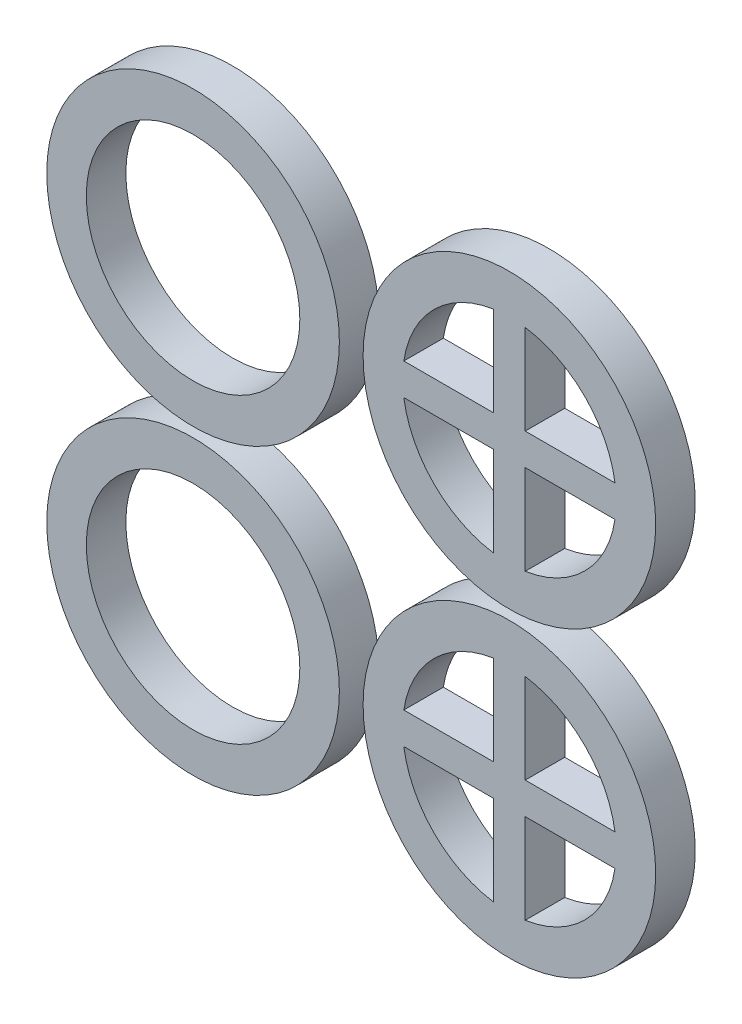
ISO-10303-21;
HEADER;
FILE_DESCRIPTION(('STEP AP214'),'2;1');
FILE_NAME('part.step','',(''),(''),'','','');
FILE_SCHEMA(('AUTOMOTIVE_DESIGN { 1 0 10303 214 1 1 1 1 }'));
ENDSEC;
DATA;
#1=APPLICATION_CONTEXT('core data for automotive mechanical design processes');
#2=APPLICATION_PROTOCOL_DEFINITION('international standard','automotive_design',2000,#1);
#3=PRODUCT_CONTEXT('',#1,'mechanical');
#4=PRODUCT('Part','Part','',(#3));
#5=PRODUCT_RELATED_PRODUCT_CATEGORY('part','',(#4));
#6=PRODUCT_DEFINITION_FORMATION('','',#4);
#7=PRODUCT_DEFINITION_CONTEXT('part definition',#1,'design');
#8=PRODUCT_DEFINITION('design','',#6,#7);
#9=PRODUCT_DEFINITION_SHAPE('','',#8);
#10=(LENGTH_UNIT() NAMED_UNIT(*) SI_UNIT(.MILLI.,.METRE.));
#11=(NAMED_UNIT(*) PLANE_ANGLE_UNIT() SI_UNIT($,.RADIAN.));
#12=(NAMED_UNIT(*) SI_UNIT($,.STERADIAN.) SOLID_ANGLE_UNIT());
#13=UNCERTAINTY_MEASURE_WITH_UNIT(LENGTH_MEASURE(1.E-05),#10,'distance_accuracy_value','');
#14=(GEOMETRIC_REPRESENTATION_CONTEXT(3) GLOBAL_UNCERTAINTY_ASSIGNED_CONTEXT((#13)) GLOBAL_UNIT_ASSIGNED_CONTEXT((#10,
#11,#12)) REPRESENTATION_CONTEXT('',''));
#15=CARTESIAN_POINT('',(0.,0.,0.));
#16=DIRECTION('',(0.,0.,1.));
#17=DIRECTION('',(1.,0.,0.));
#18=AXIS2_PLACEMENT_3D('',#15,#16,#17);
#19=CARTESIAN_POINT('',(40.,-38.2182769009653,5.));
#20=DIRECTION('',(0.,0.,1.));
#21=DIRECTION('',(1.,0.,0.));
#22=AXIS2_PLACEMENT_3D('',#19,#20,#21);
#23=PLANE('',#22);
#24=CARTESIAN_POINT('',(40.,-38.2182769009653,5.));
#25=DIRECTION('',(0.,0.,1.));
#26=DIRECTION('',(1.,0.,0.));
#27=AXIS2_PLACEMENT_3D('',#24,#25,#26);
#28=CIRCLE('',#27,18.5);
#29=CARTESIAN_POINT('',(58.5,-38.2182769009653,5.));
#30=VERTEX_POINT('',#29);
#31=EDGE_CURVE('E12',#30,#30,#28,.T.);
#32=ORIENTED_EDGE('',*,*,#31,.T.);
#33=EDGE_LOOP('',(#32));
#34=FACE_BOUND('',#33,.T.);
#35=DIRECTION('',(1.,0.,0.));
#36=VECTOR('',#35,1.);
#37=CARTESIAN_POINT('',(26.6489700771813,-36.2182769009653,5.));
#38=LINE('',#37,#36);
#39=CARTESIAN_POINT('',(26.6489700771813,-36.2182769009653,5.));
#40=VERTEX_POINT('',#39);
#41=CARTESIAN_POINT('',(38.,-36.2182769009653,5.));
#42=VERTEX_POINT('',#41);
#43=EDGE_CURVE('E208',#40,#42,#38,.T.);
#44=ORIENTED_EDGE('',*,*,#43,.F.);
#45=CARTESIAN_POINT('',(40.,-38.2182769009653,5.));
#46=DIRECTION('',(0.,0.,1.));
#47=DIRECTION('',(1.,0.,0.));
#48=AXIS2_PLACEMENT_3D('',#45,#46,#47);
#49=CIRCLE('',#48,13.5);
#50=CARTESIAN_POINT('',(38.,-24.8672469781466,5.));
#51=VERTEX_POINT('',#50);
#52=EDGE_CURVE('E206',#51,#40,#49,.T.);
#53=ORIENTED_EDGE('',*,*,#52,.F.);
#54=DIRECTION('',(0.,1.,0.));
#55=VECTOR('',#54,1.);
#56=CARTESIAN_POINT('',(38.,-24.8672469781466,5.));
#57=LINE('',#56,#55);
#58=EDGE_CURVE('E212',#42,#51,#57,.T.);
#59=ORIENTED_EDGE('',*,*,#58,.F.);
#60=EDGE_LOOP('',(#44,#53,#59));
#61=FACE_BOUND('',#60,.T.);
#62=DIRECTION('',(0.,1.,0.));
#63=VECTOR('',#62,1.);
#64=CARTESIAN_POINT('',(38.,-40.2182769009653,5.));
#65=LINE('',#64,#63);
#66=CARTESIAN_POINT('',(38.,-51.569306823784,5.));
#67=VERTEX_POINT('',#66);
#68=CARTESIAN_POINT('',(38.,-40.2182769009653,5.));
#69=VERTEX_POINT('',#68);
#70=EDGE_CURVE('E184',#67,#69,#65,.T.);
#71=ORIENTED_EDGE('',*,*,#70,.F.);
#72=CARTESIAN_POINT('',(40.,-38.2182769009653,5.));
#73=DIRECTION('',(0.,0.,1.));
#74=DIRECTION('',(1.,0.,0.));
#75=AXIS2_PLACEMENT_3D('',#72,#73,#74);
#76=CIRCLE('',#75,13.5);
#77=CARTESIAN_POINT('',(26.6489700771813,-40.2182769009653,5.));
#78=VERTEX_POINT('',#77);
#79=EDGE_CURVE('E182',#78,#67,#76,.T.);
#80=ORIENTED_EDGE('',*,*,#79,.F.);
#81=DIRECTION('',(-1.,0.,0.));
#82=VECTOR('',#81,1.);
#83=CARTESIAN_POINT('',(26.6489700771813,-40.2182769009653,5.));
#84=LINE('',#83,#82);
#85=EDGE_CURVE('E188',#69,#78,#84,.T.);
#86=ORIENTED_EDGE('',*,*,#85,.F.);
#87=EDGE_LOOP('',(#71,#80,#86));
#88=FACE_BOUND('',#87,.T.);
#89=DIRECTION('',(-1.,0.,0.));
#90=VECTOR('',#89,1.);
#91=CARTESIAN_POINT('',(42.,-40.2182769009653,5.));
#92=LINE('',#91,#90);
#93=CARTESIAN_POINT('',(53.3510299228187,-40.2182769009653,5.));
#94=VERTEX_POINT('',#93);
#95=CARTESIAN_POINT('',(42.,-40.2182769009653,5.));
#96=VERTEX_POINT('',#95);
#97=EDGE_CURVE('E160',#94,#96,#92,.T.);
#98=ORIENTED_EDGE('',*,*,#97,.F.);
#99=CARTESIAN_POINT('',(40.,-38.2182769009653,5.));
#100=DIRECTION('',(0.,0.,1.));
#101=DIRECTION('',(1.,0.,0.));
#102=AXIS2_PLACEMENT_3D('',#99,#100,#101);
#103=CIRCLE('',#102,13.5);
#104=CARTESIAN_POINT('',(42.,-51.569306823784,5.));
#105=VERTEX_POINT('',#104);
#106=EDGE_CURVE('E158',#105,#94,#103,.T.);
#107=ORIENTED_EDGE('',*,*,#106,.F.);
#108=DIRECTION('',(0.,-1.,0.));
#109=VECTOR('',#108,1.);
#110=CARTESIAN_POINT('',(42.,-40.2182769009653,5.));
#111=LINE('',#110,#109);
#112=EDGE_CURVE('E164',#96,#105,#111,.T.);
#113=ORIENTED_EDGE('',*,*,#112,.F.);
#114=EDGE_LOOP('',(#98,#107,#113));
#115=FACE_BOUND('',#114,.T.);
#116=DIRECTION('',(0.,-1.,0.));
#117=VECTOR('',#116,1.);
#118=CARTESIAN_POINT('',(42.,-24.8672469781466,5.));
#119=LINE('',#118,#117);
#120=CARTESIAN_POINT('',(42.,-24.8672469781466,5.));
#121=VERTEX_POINT('',#120);
#122=CARTESIAN_POINT('',(42.,-36.2182769009653,5.));
#123=VERTEX_POINT('',#122);
#124=EDGE_CURVE('E139',#121,#123,#119,.T.);
#125=ORIENTED_EDGE('',*,*,#124,.F.);
#126=CARTESIAN_POINT('',(40.,-38.2182769009653,5.));
#127=DIRECTION('',(0.,0.,1.));
#128=DIRECTION('',(1.,0.,0.));
#129=AXIS2_PLACEMENT_3D('',#126,#127,#128);
#130=CIRCLE('',#129,13.5);
#131=CARTESIAN_POINT('',(53.3510299228187,-36.2182769009653,5.));
#132=VERTEX_POINT('',#131);
#133=EDGE_CURVE('E131',#132,#121,#130,.T.);
#134=ORIENTED_EDGE('',*,*,#133,.F.);
#135=DIRECTION('',(1.,0.,0.));
#136=VECTOR('',#135,1.);
#137=CARTESIAN_POINT('',(42.,-36.2182769009653,5.));
#138=LINE('',#137,#136);
#139=EDGE_CURVE('E148',#123,#132,#138,.T.);
#140=ORIENTED_EDGE('',*,*,#139,.F.);
#141=EDGE_LOOP('',(#125,#134,#140));
#142=FACE_BOUND('',#141,.T.);
#143=ADVANCED_FACE('F42',(#34,#61,#88,#115,#142),#23,.T.);
#144=CARTESIAN_POINT('',(40.,-38.2182769009653,0.));
#145=DIRECTION('',(0.,0.,1.));
#146=DIRECTION('',(1.,0.,0.));
#147=AXIS2_PLACEMENT_3D('',#144,#145,#146);
#148=PLANE('',#147);
#149=CARTESIAN_POINT('',(40.,-38.2182769009653,0.));
#150=DIRECTION('',(0.,0.,1.));
#151=DIRECTION('',(1.,0.,0.));
#152=AXIS2_PLACEMENT_3D('',#149,#150,#151);
#153=CIRCLE('',#152,13.5);
#154=CARTESIAN_POINT('',(42.,-51.569306823784,0.));
#155=VERTEX_POINT('',#154);
#156=CARTESIAN_POINT('',(53.3510299228187,-40.2182769009653,0.));
#157=VERTEX_POINT('',#156);
#158=EDGE_CURVE('E146',#155,#157,#153,.T.);
#159=ORIENTED_EDGE('',*,*,#158,.T.);
#160=DIRECTION('',(-1.,0.,0.));
#161=VECTOR('',#160,1.);
#162=CARTESIAN_POINT('',(42.,-40.2182769009653,0.));
#163=LINE('',#162,#161);
#164=CARTESIAN_POINT('',(42.,-40.2182769009653,0.));
#165=VERTEX_POINT('',#164);
#166=EDGE_CURVE('E169',#157,#165,#163,.T.);
#167=ORIENTED_EDGE('',*,*,#166,.T.);
#168=DIRECTION('',(0.,-1.,0.));
#169=VECTOR('',#168,1.);
#170=CARTESIAN_POINT('',(42.,-40.2182769009653,0.));
#171=LINE('',#170,#169);
#172=EDGE_CURVE('E161',#165,#155,#171,.T.);
#173=ORIENTED_EDGE('',*,*,#172,.T.);
#174=EDGE_LOOP('',(#159,#167,#173));
#175=FACE_BOUND('',#174,.T.);
#176=CARTESIAN_POINT('',(40.,-38.2182769009653,0.));
#177=DIRECTION('',(0.,0.,1.));
#178=DIRECTION('',(1.,0.,0.));
#179=AXIS2_PLACEMENT_3D('',#176,#177,#178);
#180=CIRCLE('',#179,13.5);
#181=CARTESIAN_POINT('',(38.,-24.8672469781466,0.));
#182=VERTEX_POINT('',#181);
#183=CARTESIAN_POINT('',(26.6489700771813,-36.2182769009653,0.));
#184=VERTEX_POINT('',#183);
#185=EDGE_CURVE('E205',#182,#184,#180,.T.);
#186=ORIENTED_EDGE('',*,*,#185,.T.);
#187=DIRECTION('',(1.,0.,0.));
#188=VECTOR('',#187,1.);
#189=CARTESIAN_POINT('',(26.6489700771813,-36.2182769009653,0.));
#190=LINE('',#189,#188);
#191=CARTESIAN_POINT('',(38.,-36.2182769009653,0.));
#192=VERTEX_POINT('',#191);
#193=EDGE_CURVE('E217',#184,#192,#190,.T.);
#194=ORIENTED_EDGE('',*,*,#193,.T.);
#195=DIRECTION('',(0.,1.,0.));
#196=VECTOR('',#195,1.);
#197=CARTESIAN_POINT('',(38.,-24.8672469781466,0.));
#198=LINE('',#197,#196);
#199=EDGE_CURVE('E209',#192,#182,#198,.T.);
#200=ORIENTED_EDGE('',*,*,#199,.T.);
#201=EDGE_LOOP('',(#186,#194,#200));
#202=FACE_BOUND('',#201,.T.);
#203=CARTESIAN_POINT('',(40.,-38.2182769009653,0.));
#204=DIRECTION('',(0.,0.,1.));
#205=DIRECTION('',(1.,0.,0.));
#206=AXIS2_PLACEMENT_3D('',#203,#204,#205);
#207=CIRCLE('',#206,18.5);
#208=CARTESIAN_POINT('',(58.5,-38.2182769009653,0.));
#209=VERTEX_POINT('',#208);
#210=EDGE_CURVE('E46',#209,#209,#207,.T.);
#211=ORIENTED_EDGE('',*,*,#210,.F.);
#212=EDGE_LOOP('',(#211));
#213=FACE_BOUND('',#212,.T.);
#214=CARTESIAN_POINT('',(40.,-38.2182769009653,0.));
#215=DIRECTION('',(0.,0.,1.));
#216=DIRECTION('',(1.,0.,0.));
#217=AXIS2_PLACEMENT_3D('',#214,#215,#216);
#218=CIRCLE('',#217,13.5);
#219=CARTESIAN_POINT('',(26.6489700771813,-40.2182769009653,0.));
#220=VERTEX_POINT('',#219);
#221=CARTESIAN_POINT('',(38.,-51.569306823784,0.));
#222=VERTEX_POINT('',#221);
#223=EDGE_CURVE('E181',#220,#222,#218,.T.);
#224=ORIENTED_EDGE('',*,*,#223,.T.);
#225=DIRECTION('',(0.,1.,0.));
#226=VECTOR('',#225,1.);
#227=CARTESIAN_POINT('',(38.,-40.2182769009653,0.));
#228=LINE('',#227,#226);
#229=CARTESIAN_POINT('',(38.,-40.2182769009653,0.));
#230=VERTEX_POINT('',#229);
#231=EDGE_CURVE('E193',#222,#230,#228,.T.);
#232=ORIENTED_EDGE('',*,*,#231,.T.);
#233=DIRECTION('',(-1.,0.,0.));
#234=VECTOR('',#233,1.);
#235=CARTESIAN_POINT('',(26.6489700771813,-40.2182769009653,0.));
#236=LINE('',#235,#234);
#237=EDGE_CURVE('E185',#230,#220,#236,.T.);
#238=ORIENTED_EDGE('',*,*,#237,.T.);
#239=EDGE_LOOP('',(#224,#232,#238));
#240=FACE_BOUND('',#239,.T.);
#241=CARTESIAN_POINT('',(40.,-38.2182769009653,0.));
#242=DIRECTION('',(0.,0.,1.));
#243=DIRECTION('',(1.,0.,0.));
#244=AXIS2_PLACEMENT_3D('',#241,#242,#243);
#245=CIRCLE('',#244,13.5);
#246=CARTESIAN_POINT('',(53.3510299228187,-36.2182769009653,0.));
#247=VERTEX_POINT('',#246);
#248=CARTESIAN_POINT('',(42.,-24.8672469781466,0.));
#249=VERTEX_POINT('',#248);
#250=EDGE_CURVE('E65',#247,#249,#245,.T.);
#251=ORIENTED_EDGE('',*,*,#250,.T.);
#252=DIRECTION('',(0.,-1.,0.));
#253=VECTOR('',#252,1.);
#254=CARTESIAN_POINT('',(42.,-24.8672469781466,0.));
#255=LINE('',#254,#253);
#256=CARTESIAN_POINT('',(42.,-36.2182769009653,0.));
#257=VERTEX_POINT('',#256);
#258=EDGE_CURVE('E145',#249,#257,#255,.T.);
#259=ORIENTED_EDGE('',*,*,#258,.T.);
#260=DIRECTION('',(1.,0.,0.));
#261=VECTOR('',#260,1.);
#262=CARTESIAN_POINT('',(42.,-36.2182769009653,0.));
#263=LINE('',#262,#261);
#264=EDGE_CURVE('E140',#257,#247,#263,.T.);
#265=ORIENTED_EDGE('',*,*,#264,.T.);
#266=EDGE_LOOP('',(#251,#259,#265));
#267=FACE_BOUND('',#266,.T.);
#268=ADVANCED_FACE('F234',(#175,#202,#213,#240,#267),#148,.F.);
#269=CARTESIAN_POINT('',(40.,-38.2182769009653,5.));
#270=DIRECTION('',(0.,0.,-1.));
#271=DIRECTION('',(-1.,0.,0.));
#272=AXIS2_PLACEMENT_3D('',#269,#270,#271);
#273=CYLINDRICAL_SURFACE('',#272,18.5);
#274=ORIENTED_EDGE('',*,*,#31,.F.);
#275=EDGE_LOOP('',(#274));
#276=FACE_BOUND('',#275,.T.);
#277=ORIENTED_EDGE('',*,*,#210,.T.);
#278=EDGE_LOOP('',(#277));
#279=FACE_BOUND('',#278,.T.);
#280=ADVANCED_FACE('F44',(#276,#279),#273,.T.);
#281=CARTESIAN_POINT('',(40.,-38.2182769009653,5.));
#282=DIRECTION('',(0.,0.,-1.));
#283=DIRECTION('',(-1.,0.,0.));
#284=AXIS2_PLACEMENT_3D('',#281,#282,#283);
#285=CYLINDRICAL_SURFACE('',#284,13.5);
#286=ORIENTED_EDGE('',*,*,#185,.F.);
#287=DIRECTION('',(0.,0.,-1.));
#288=VECTOR('',#287,1.);
#289=CARTESIAN_POINT('',(38.,-24.8672469781466,5.));
#290=LINE('',#289,#288);
#291=EDGE_CURVE('E214',#51,#182,#290,.T.);
#292=ORIENTED_EDGE('',*,*,#291,.F.);
#293=ORIENTED_EDGE('',*,*,#52,.T.);
#294=DIRECTION('',(0.,0.,-1.));
#295=VECTOR('',#294,1.);
#296=CARTESIAN_POINT('',(26.6489700771813,-36.2182769009653,5.));
#297=LINE('',#296,#295);
#298=EDGE_CURVE('E226',#40,#184,#297,.T.);
#299=ORIENTED_EDGE('',*,*,#298,.T.);
#300=EDGE_LOOP('',(#286,#292,#293,#299));
#301=FACE_BOUND('',#300,.T.);
#302=ADVANCED_FACE('F253',(#301),#285,.F.);
#303=CARTESIAN_POINT('',(26.6489700771813,-36.2182769009653,5.));
#304=DIRECTION('',(0.,1.,0.));
#305=DIRECTION('',(0.,0.,1.));
#306=AXIS2_PLACEMENT_3D('',#303,#304,#305);
#307=PLANE('',#306);
#308=ORIENTED_EDGE('',*,*,#193,.F.);
#309=ORIENTED_EDGE('',*,*,#298,.F.);
#310=ORIENTED_EDGE('',*,*,#43,.T.);
#311=DIRECTION('',(0.,0.,-1.));
#312=VECTOR('',#311,1.);
#313=CARTESIAN_POINT('',(38.,-36.2182769009653,5.));
#314=LINE('',#313,#312);
#315=EDGE_CURVE('E224',#42,#192,#314,.T.);
#316=ORIENTED_EDGE('',*,*,#315,.T.);
#317=EDGE_LOOP('',(#308,#309,#310,#316));
#318=FACE_BOUND('',#317,.T.);
#319=ADVANCED_FACE('F256',(#318),#307,.T.);
#320=CARTESIAN_POINT('',(38.,-24.8672469781466,5.));
#321=DIRECTION('',(-1.,0.,0.));
#322=DIRECTION('',(0.,0.,1.));
#323=AXIS2_PLACEMENT_3D('',#320,#321,#322);
#324=PLANE('',#323);
#325=ORIENTED_EDGE('',*,*,#199,.F.);
#326=ORIENTED_EDGE('',*,*,#315,.F.);
#327=ORIENTED_EDGE('',*,*,#58,.T.);
#328=ORIENTED_EDGE('',*,*,#291,.T.);
#329=EDGE_LOOP('',(#325,#326,#327,#328));
#330=FACE_BOUND('',#329,.T.);
#331=ADVANCED_FACE('F259',(#330),#324,.T.);
#332=CARTESIAN_POINT('',(40.,-38.2182769009653,5.));
#333=DIRECTION('',(0.,0.,-1.));
#334=DIRECTION('',(-1.,0.,0.));
#335=AXIS2_PLACEMENT_3D('',#332,#333,#334);
#336=CYLINDRICAL_SURFACE('',#335,13.5);
#337=ORIENTED_EDGE('',*,*,#223,.F.);
#338=DIRECTION('',(0.,0.,-1.));
#339=VECTOR('',#338,1.);
#340=CARTESIAN_POINT('',(26.6489700771813,-40.2182769009653,5.));
#341=LINE('',#340,#339);
#342=EDGE_CURVE('E190',#78,#220,#341,.T.);
#343=ORIENTED_EDGE('',*,*,#342,.F.);
#344=ORIENTED_EDGE('',*,*,#79,.T.);
#345=DIRECTION('',(0.,0.,-1.));
#346=VECTOR('',#345,1.);
#347=CARTESIAN_POINT('',(38.,-51.569306823784,5.));
#348=LINE('',#347,#346);
#349=EDGE_CURVE('E202',#67,#222,#348,.T.);
#350=ORIENTED_EDGE('',*,*,#349,.T.);
#351=EDGE_LOOP('',(#337,#343,#344,#350));
#352=FACE_BOUND('',#351,.T.);
#353=ADVANCED_FACE('F263',(#352),#336,.F.);
#354=CARTESIAN_POINT('',(38.,-40.2182769009653,5.));
#355=DIRECTION('',(-1.,0.,0.));
#356=DIRECTION('',(0.,0.,1.));
#357=AXIS2_PLACEMENT_3D('',#354,#355,#356);
#358=PLANE('',#357);
#359=ORIENTED_EDGE('',*,*,#231,.F.);
#360=ORIENTED_EDGE('',*,*,#349,.F.);
#361=ORIENTED_EDGE('',*,*,#70,.T.);
#362=DIRECTION('',(0.,0.,-1.));
#363=VECTOR('',#362,1.);
#364=CARTESIAN_POINT('',(38.,-40.2182769009653,5.));
#365=LINE('',#364,#363);
#366=EDGE_CURVE('E200',#69,#230,#365,.T.);
#367=ORIENTED_EDGE('',*,*,#366,.T.);
#368=EDGE_LOOP('',(#359,#360,#361,#367));
#369=FACE_BOUND('',#368,.T.);
#370=ADVANCED_FACE('F267',(#369),#358,.T.);
#371=CARTESIAN_POINT('',(26.6489700771813,-40.2182769009653,5.));
#372=DIRECTION('',(0.,-1.,0.));
#373=DIRECTION('',(0.,0.,-1.));
#374=AXIS2_PLACEMENT_3D('',#371,#372,#373);
#375=PLANE('',#374);
#376=ORIENTED_EDGE('',*,*,#237,.F.);
#377=ORIENTED_EDGE('',*,*,#366,.F.);
#378=ORIENTED_EDGE('',*,*,#85,.T.);
#379=ORIENTED_EDGE('',*,*,#342,.T.);
#380=EDGE_LOOP('',(#376,#377,#378,#379));
#381=FACE_BOUND('',#380,.T.);
#382=ADVANCED_FACE('F271',(#381),#375,.T.);
#383=CARTESIAN_POINT('',(40.,-38.2182769009653,5.));
#384=DIRECTION('',(0.,0.,-1.));
#385=DIRECTION('',(-1.,0.,0.));
#386=AXIS2_PLACEMENT_3D('',#383,#384,#385);
#387=CYLINDRICAL_SURFACE('',#386,13.5);
#388=ORIENTED_EDGE('',*,*,#158,.F.);
#389=DIRECTION('',(0.,0.,-1.));
#390=VECTOR('',#389,1.);
#391=CARTESIAN_POINT('',(42.,-51.569306823784,5.));
#392=LINE('',#391,#390);
#393=EDGE_CURVE('E166',#105,#155,#392,.T.);
#394=ORIENTED_EDGE('',*,*,#393,.F.);
#395=ORIENTED_EDGE('',*,*,#106,.T.);
#396=DIRECTION('',(0.,0.,-1.));
#397=VECTOR('',#396,1.);
#398=CARTESIAN_POINT('',(53.3510299228187,-40.2182769009653,5.));
#399=LINE('',#398,#397);
#400=EDGE_CURVE('E178',#94,#157,#399,.T.);
#401=ORIENTED_EDGE('',*,*,#400,.T.);
#402=EDGE_LOOP('',(#388,#394,#395,#401));
#403=FACE_BOUND('',#402,.T.);
#404=ADVANCED_FACE('F275',(#403),#387,.F.);
#405=CARTESIAN_POINT('',(42.,-40.2182769009653,5.));
#406=DIRECTION('',(0.,-1.,0.));
#407=DIRECTION('',(0.,0.,-1.));
#408=AXIS2_PLACEMENT_3D('',#405,#406,#407);
#409=PLANE('',#408);
#410=ORIENTED_EDGE('',*,*,#166,.F.);
#411=ORIENTED_EDGE('',*,*,#400,.F.);
#412=ORIENTED_EDGE('',*,*,#97,.T.);
#413=DIRECTION('',(0.,0.,-1.));
#414=VECTOR('',#413,1.);
#415=CARTESIAN_POINT('',(42.,-40.2182769009653,5.));
#416=LINE('',#415,#414);
#417=EDGE_CURVE('E176',#96,#165,#416,.T.);
#418=ORIENTED_EDGE('',*,*,#417,.T.);
#419=EDGE_LOOP('',(#410,#411,#412,#418));
#420=FACE_BOUND('',#419,.T.);
#421=ADVANCED_FACE('F279',(#420),#409,.T.);
#422=CARTESIAN_POINT('',(42.,-40.2182769009653,5.));
#423=DIRECTION('',(1.,0.,0.));
#424=DIRECTION('',(0.,0.,-1.));
#425=AXIS2_PLACEMENT_3D('',#422,#423,#424);
#426=PLANE('',#425);
#427=ORIENTED_EDGE('',*,*,#172,.F.);
#428=ORIENTED_EDGE('',*,*,#417,.F.);
#429=ORIENTED_EDGE('',*,*,#112,.T.);
#430=ORIENTED_EDGE('',*,*,#393,.T.);
#431=EDGE_LOOP('',(#427,#428,#429,#430));
#432=FACE_BOUND('',#431,.T.);
#433=ADVANCED_FACE('F283',(#432),#426,.T.);
#434=CARTESIAN_POINT('',(40.,-38.2182769009653,5.));
#435=DIRECTION('',(0.,0.,-1.));
#436=DIRECTION('',(-1.,0.,0.));
#437=AXIS2_PLACEMENT_3D('',#434,#435,#436);
#438=CYLINDRICAL_SURFACE('',#437,13.5);
#439=ORIENTED_EDGE('',*,*,#250,.F.);
#440=DIRECTION('',(0.,0.,-1.));
#441=VECTOR('',#440,1.);
#442=CARTESIAN_POINT('',(53.3510299228187,-36.2182769009653,5.));
#443=LINE('',#442,#441);
#444=EDGE_CURVE('E135',#132,#247,#443,.T.);
#445=ORIENTED_EDGE('',*,*,#444,.F.);
#446=ORIENTED_EDGE('',*,*,#133,.T.);
#447=DIRECTION('',(0.,0.,-1.));
#448=VECTOR('',#447,1.);
#449=CARTESIAN_POINT('',(42.,-24.8672469781466,5.));
#450=LINE('',#449,#448);
#451=EDGE_CURVE('E134',#121,#249,#450,.T.);
#452=ORIENTED_EDGE('',*,*,#451,.T.);
#453=EDGE_LOOP('',(#439,#445,#446,#452));
#454=FACE_BOUND('',#453,.T.);
#455=ADVANCED_FACE('F133',(#454),#438,.F.);
#456=CARTESIAN_POINT('',(42.,-24.8672469781466,5.));
#457=DIRECTION('',(1.,0.,0.));
#458=DIRECTION('',(0.,0.,-1.));
#459=AXIS2_PLACEMENT_3D('',#456,#457,#458);
#460=PLANE('',#459);
#461=ORIENTED_EDGE('',*,*,#258,.F.);
#462=ORIENTED_EDGE('',*,*,#451,.F.);
#463=ORIENTED_EDGE('',*,*,#124,.T.);
#464=DIRECTION('',(0.,0.,-1.));
#465=VECTOR('',#464,1.);
#466=CARTESIAN_POINT('',(42.,-36.2182769009653,5.));
#467=LINE('',#466,#465);
#468=EDGE_CURVE('E57',#123,#257,#467,.T.);
#469=ORIENTED_EDGE('',*,*,#468,.T.);
#470=EDGE_LOOP('',(#461,#462,#463,#469));
#471=FACE_BOUND('',#470,.T.);
#472=ADVANCED_FACE('F143',(#471),#460,.T.);
#473=CARTESIAN_POINT('',(42.,-36.2182769009653,5.));
#474=DIRECTION('',(0.,1.,0.));
#475=DIRECTION('',(0.,0.,1.));
#476=AXIS2_PLACEMENT_3D('',#473,#474,#475);
#477=PLANE('',#476);
#478=ORIENTED_EDGE('',*,*,#264,.F.);
#479=ORIENTED_EDGE('',*,*,#468,.F.);
#480=ORIENTED_EDGE('',*,*,#139,.T.);
#481=ORIENTED_EDGE('',*,*,#444,.T.);
#482=EDGE_LOOP('',(#478,#479,#480,#481));
#483=FACE_BOUND('',#482,.T.);
#484=ADVANCED_FACE('F239',(#483),#477,.T.);
#485=CLOSED_SHELL('',(#143,#268,#280,#302,#319,#331,#353,#370,#382,#404,#421,#433,#455,#472,#484));
#486=MANIFOLD_SOLID_BREP('B2',#485);
#487=CARTESIAN_POINT('',(0.,-38.2182769009653,5.));
#488=DIRECTION('',(0.,0.,1.));
#489=DIRECTION('',(1.,0.,0.));
#490=AXIS2_PLACEMENT_3D('',#487,#488,#489);
#491=PLANE('',#490);
#492=CARTESIAN_POINT('',(0.,-38.2182769009653,5.));
#493=DIRECTION('',(0.,0.,1.));
#494=DIRECTION('',(1.,0.,0.));
#495=AXIS2_PLACEMENT_3D('',#492,#493,#494);
#496=CIRCLE('',#495,18.5);
#497=CARTESIAN_POINT('',(18.5,-38.2182769009653,5.));
#498=VERTEX_POINT('',#497);
#499=EDGE_CURVE('E41',#498,#498,#496,.T.);
#500=ORIENTED_EDGE('',*,*,#499,.T.);
#501=EDGE_LOOP('',(#500));
#502=FACE_BOUND('',#501,.T.);
#503=CARTESIAN_POINT('',(0.,-38.2182769009653,5.));
#504=DIRECTION('',(0.,0.,1.));
#505=DIRECTION('',(1.,0.,0.));
#506=AXIS2_PLACEMENT_3D('',#503,#504,#505);
#507=CIRCLE('',#506,13.5);
#508=CARTESIAN_POINT('',(13.5,-38.2182769009653,5.));
#509=VERTEX_POINT('',#508);
#510=EDGE_CURVE('E422',#509,#509,#507,.T.);
#511=ORIENTED_EDGE('',*,*,#510,.F.);
#512=EDGE_LOOP('',(#511));
#513=FACE_BOUND('',#512,.T.);
#514=ADVANCED_FACE('F411',(#502,#513),#491,.T.);
#515=CARTESIAN_POINT('',(0.,-38.2182769009653,0.));
#516=DIRECTION('',(0.,0.,1.));
#517=DIRECTION('',(1.,0.,0.));
#518=AXIS2_PLACEMENT_3D('',#515,#516,#517);
#519=PLANE('',#518);
#520=CARTESIAN_POINT('',(0.,-38.2182769009653,0.));
#521=DIRECTION('',(0.,0.,1.));
#522=DIRECTION('',(1.,0.,0.));
#523=AXIS2_PLACEMENT_3D('',#520,#521,#522);
#524=CIRCLE('',#523,18.5);
#525=CARTESIAN_POINT('',(18.5,-38.2182769009653,0.));
#526=VERTEX_POINT('',#525);
#527=EDGE_CURVE('E415',#526,#526,#524,.T.);
#528=ORIENTED_EDGE('',*,*,#527,.F.);
#529=EDGE_LOOP('',(#528));
#530=FACE_BOUND('',#529,.T.);
#531=CARTESIAN_POINT('',(0.,-38.2182769009653,0.));
#532=DIRECTION('',(0.,0.,1.));
#533=DIRECTION('',(1.,0.,0.));
#534=AXIS2_PLACEMENT_3D('',#531,#532,#533);
#535=CIRCLE('',#534,13.5);
#536=CARTESIAN_POINT('',(13.5,-38.2182769009653,0.));
#537=VERTEX_POINT('',#536);
#538=EDGE_CURVE('E424',#537,#537,#535,.T.);
#539=ORIENTED_EDGE('',*,*,#538,.T.);
#540=EDGE_LOOP('',(#539));
#541=FACE_BOUND('',#540,.T.);
#542=ADVANCED_FACE('F434',(#530,#541),#519,.F.);
#543=CARTESIAN_POINT('',(0.,-38.2182769009653,5.));
#544=DIRECTION('',(0.,0.,-1.));
#545=DIRECTION('',(-1.,0.,0.));
#546=AXIS2_PLACEMENT_3D('',#543,#544,#545);
#547=CYLINDRICAL_SURFACE('',#546,18.5);
#548=ORIENTED_EDGE('',*,*,#499,.F.);
#549=EDGE_LOOP('',(#548));
#550=FACE_BOUND('',#549,.T.);
#551=ORIENTED_EDGE('',*,*,#527,.T.);
#552=EDGE_LOOP('',(#551));
#553=FACE_BOUND('',#552,.T.);
#554=ADVANCED_FACE('F413',(#550,#553),#547,.T.);
#555=CARTESIAN_POINT('',(0.,-38.2182769009653,5.));
#556=DIRECTION('',(0.,0.,-1.));
#557=DIRECTION('',(-1.,0.,0.));
#558=AXIS2_PLACEMENT_3D('',#555,#556,#557);
#559=CYLINDRICAL_SURFACE('',#558,13.5);
#560=ORIENTED_EDGE('',*,*,#510,.T.);
#561=EDGE_LOOP('',(#560));
#562=FACE_BOUND('',#561,.T.);
#563=ORIENTED_EDGE('',*,*,#538,.F.);
#564=EDGE_LOOP('',(#563));
#565=FACE_BOUND('',#564,.T.);
#566=ADVANCED_FACE('F430',(#562,#565),#559,.F.);
#567=CLOSED_SHELL('',(#514,#542,#554,#566));
#568=MANIFOLD_SOLID_BREP('B6',#567);
#569=CARTESIAN_POINT('',(40.,0.,5.));
#570=DIRECTION('',(0.,0.,1.));
#571=DIRECTION('',(1.,0.,0.));
#572=AXIS2_PLACEMENT_3D('',#569,#570,#571);
#573=PLANE('',#572);
#574=CARTESIAN_POINT('',(40.,0.,5.));
#575=DIRECTION('',(0.,0.,1.));
#576=DIRECTION('',(1.,0.,0.));
#577=AXIS2_PLACEMENT_3D('',#574,#575,#576);
#578=CIRCLE('',#577,18.5);
#579=CARTESIAN_POINT('',(58.5,0.,5.));
#580=VERTEX_POINT('',#579);
#581=EDGE_CURVE('E409',#580,#580,#578,.T.);
#582=ORIENTED_EDGE('',*,*,#581,.T.);
#583=EDGE_LOOP('',(#582));
#584=FACE_BOUND('',#583,.T.);
#585=DIRECTION('',(1.,0.,0.));
#586=VECTOR('',#585,1.);
#587=CARTESIAN_POINT('',(26.6489700771813,2.,5.));
#588=LINE('',#587,#586);
#589=CARTESIAN_POINT('',(26.6489700771813,2.,5.));
#590=VERTEX_POINT('',#589);
#591=CARTESIAN_POINT('',(38.,2.,5.));
#592=VERTEX_POINT('',#591);
#593=EDGE_CURVE('E646',#590,#592,#588,.T.);
#594=ORIENTED_EDGE('',*,*,#593,.F.);
#595=CARTESIAN_POINT('',(40.,0.,5.));
#596=DIRECTION('',(0.,0.,1.));
#597=DIRECTION('',(1.,0.,0.));
#598=AXIS2_PLACEMENT_3D('',#595,#596,#597);
#599=CIRCLE('',#598,13.5);
#600=CARTESIAN_POINT('',(38.,13.3510299228187,5.));
#601=VERTEX_POINT('',#600);
#602=EDGE_CURVE('E644',#601,#590,#599,.T.);
#603=ORIENTED_EDGE('',*,*,#602,.F.);
#604=DIRECTION('',(0.,1.,0.));
#605=VECTOR('',#604,1.);
#606=CARTESIAN_POINT('',(38.,13.3510299228187,5.));
#607=LINE('',#606,#605);
#608=EDGE_CURVE('E650',#592,#601,#607,.T.);
#609=ORIENTED_EDGE('',*,*,#608,.F.);
#610=EDGE_LOOP('',(#594,#603,#609));
#611=FACE_BOUND('',#610,.T.);
#612=DIRECTION('',(0.,1.,0.));
#613=VECTOR('',#612,1.);
#614=CARTESIAN_POINT('',(38.,-2.,5.));
#615=LINE('',#614,#613);
#616=CARTESIAN_POINT('',(38.,-13.3510299228187,5.));
#617=VERTEX_POINT('',#616);
#618=CARTESIAN_POINT('',(38.,-2.,5.));
#619=VERTEX_POINT('',#618);
#620=EDGE_CURVE('E622',#617,#619,#615,.T.);
#621=ORIENTED_EDGE('',*,*,#620,.F.);
#622=CARTESIAN_POINT('',(40.,0.,5.));
#623=DIRECTION('',(0.,0.,1.));
#624=DIRECTION('',(1.,0.,0.));
#625=AXIS2_PLACEMENT_3D('',#622,#623,#624);
#626=CIRCLE('',#625,13.5);
#627=CARTESIAN_POINT('',(26.6489700771813,-2.,5.));
#628=VERTEX_POINT('',#627);
#629=EDGE_CURVE('E620',#628,#617,#626,.T.);
#630=ORIENTED_EDGE('',*,*,#629,.F.);
#631=DIRECTION('',(-1.,0.,0.));
#632=VECTOR('',#631,1.);
#633=CARTESIAN_POINT('',(26.6489700771813,-2.,5.));
#634=LINE('',#633,#632);
#635=EDGE_CURVE('E626',#619,#628,#634,.T.);
#636=ORIENTED_EDGE('',*,*,#635,.F.);
#637=EDGE_LOOP('',(#621,#630,#636));
#638=FACE_BOUND('',#637,.T.);
#639=DIRECTION('',(-1.,0.,0.));
#640=VECTOR('',#639,1.);
#641=CARTESIAN_POINT('',(42.,-2.,5.));
#642=LINE('',#641,#640);
#643=CARTESIAN_POINT('',(53.3510299228187,-2.,5.));
#644=VERTEX_POINT('',#643);
#645=CARTESIAN_POINT('',(42.,-2.,5.));
#646=VERTEX_POINT('',#645);
#647=EDGE_CURVE('E598',#644,#646,#642,.T.);
#648=ORIENTED_EDGE('',*,*,#647,.F.);
#649=CARTESIAN_POINT('',(40.,0.,5.));
#650=DIRECTION('',(0.,0.,1.));
#651=DIRECTION('',(1.,0.,0.));
#652=AXIS2_PLACEMENT_3D('',#649,#650,#651);
#653=CIRCLE('',#652,13.5);
#654=CARTESIAN_POINT('',(42.,-13.3510299228187,5.));
#655=VERTEX_POINT('',#654);
#656=EDGE_CURVE('E596',#655,#644,#653,.T.);
#657=ORIENTED_EDGE('',*,*,#656,.F.);
#658=DIRECTION('',(0.,-1.,0.));
#659=VECTOR('',#658,1.);
#660=CARTESIAN_POINT('',(42.,-2.,5.));
#661=LINE('',#660,#659);
#662=EDGE_CURVE('E602',#646,#655,#661,.T.);
#663=ORIENTED_EDGE('',*,*,#662,.F.);
#664=EDGE_LOOP('',(#648,#657,#663));
#665=FACE_BOUND('',#664,.T.);
#666=DIRECTION('',(0.,-1.,0.));
#667=VECTOR('',#666,1.);
#668=CARTESIAN_POINT('',(42.,13.3510299228187,5.));
#669=LINE('',#668,#667);
#670=CARTESIAN_POINT('',(42.,13.3510299228187,5.));
#671=VERTEX_POINT('',#670);
#672=CARTESIAN_POINT('',(42.,2.,5.));
#673=VERTEX_POINT('',#672);
#674=EDGE_CURVE('E577',#671,#673,#669,.T.);
#675=ORIENTED_EDGE('',*,*,#674,.F.);
#676=CARTESIAN_POINT('',(40.,0.,5.));
#677=DIRECTION('',(0.,0.,1.));
#678=DIRECTION('',(1.,0.,0.));
#679=AXIS2_PLACEMENT_3D('',#676,#677,#678);
#680=CIRCLE('',#679,13.5);
#681=CARTESIAN_POINT('',(53.3510299228187,2.,5.));
#682=VERTEX_POINT('',#681);
#683=EDGE_CURVE('E569',#682,#671,#680,.T.);
#684=ORIENTED_EDGE('',*,*,#683,.F.);
#685=DIRECTION('',(1.,0.,0.));
#686=VECTOR('',#685,1.);
#687=CARTESIAN_POINT('',(42.,2.,5.));
#688=LINE('',#687,#686);
#689=EDGE_CURVE('E586',#673,#682,#688,.T.);
#690=ORIENTED_EDGE('',*,*,#689,.F.);
#691=EDGE_LOOP('',(#675,#684,#690));
#692=FACE_BOUND('',#691,.T.);
#693=ADVANCED_FACE('F480',(#584,#611,#638,#665,#692),#573,.T.);
#694=CARTESIAN_POINT('',(40.,0.,0.));
#695=DIRECTION('',(0.,0.,1.));
#696=DIRECTION('',(1.,0.,0.));
#697=AXIS2_PLACEMENT_3D('',#694,#695,#696);
#698=PLANE('',#697);
#699=CARTESIAN_POINT('',(40.,0.,0.));
#700=DIRECTION('',(0.,0.,1.));
#701=DIRECTION('',(1.,0.,0.));
#702=AXIS2_PLACEMENT_3D('',#699,#700,#701);
#703=CIRCLE('',#702,13.5);
#704=CARTESIAN_POINT('',(42.,-13.3510299228187,0.));
#705=VERTEX_POINT('',#704);
#706=CARTESIAN_POINT('',(53.3510299228187,-2.,0.));
#707=VERTEX_POINT('',#706);
#708=EDGE_CURVE('E584',#705,#707,#703,.T.);
#709=ORIENTED_EDGE('',*,*,#708,.T.);
#710=DIRECTION('',(-1.,0.,0.));
#711=VECTOR('',#710,1.);
#712=CARTESIAN_POINT('',(42.,-2.,0.));
#713=LINE('',#712,#711);
#714=CARTESIAN_POINT('',(42.,-2.,0.));
#715=VERTEX_POINT('',#714);
#716=EDGE_CURVE('E607',#707,#715,#713,.T.);
#717=ORIENTED_EDGE('',*,*,#716,.T.);
#718=DIRECTION('',(0.,-1.,0.));
#719=VECTOR('',#718,1.);
#720=CARTESIAN_POINT('',(42.,-2.,0.));
#721=LINE('',#720,#719);
#722=EDGE_CURVE('E599',#715,#705,#721,.T.);
#723=ORIENTED_EDGE('',*,*,#722,.T.);
#724=EDGE_LOOP('',(#709,#717,#723));
#725=FACE_BOUND('',#724,.T.);
#726=CARTESIAN_POINT('',(40.,0.,0.));
#727=DIRECTION('',(0.,0.,1.));
#728=DIRECTION('',(1.,0.,0.));
#729=AXIS2_PLACEMENT_3D('',#726,#727,#728);
#730=CIRCLE('',#729,13.5);
#731=CARTESIAN_POINT('',(38.,13.3510299228187,0.));
#732=VERTEX_POINT('',#731);
#733=CARTESIAN_POINT('',(26.6489700771813,2.,0.));
#734=VERTEX_POINT('',#733);
#735=EDGE_CURVE('E643',#732,#734,#730,.T.);
#736=ORIENTED_EDGE('',*,*,#735,.T.);
#737=DIRECTION('',(1.,0.,0.));
#738=VECTOR('',#737,1.);
#739=CARTESIAN_POINT('',(26.6489700771813,2.,0.));
#740=LINE('',#739,#738);
#741=CARTESIAN_POINT('',(38.,2.,0.));
#742=VERTEX_POINT('',#741);
#743=EDGE_CURVE('E655',#734,#742,#740,.T.);
#744=ORIENTED_EDGE('',*,*,#743,.T.);
#745=DIRECTION('',(0.,1.,0.));
#746=VECTOR('',#745,1.);
#747=CARTESIAN_POINT('',(38.,13.3510299228187,0.));
#748=LINE('',#747,#746);
#749=EDGE_CURVE('E647',#742,#732,#748,.T.);
#750=ORIENTED_EDGE('',*,*,#749,.T.);
#751=EDGE_LOOP('',(#736,#744,#750));
#752=FACE_BOUND('',#751,.T.);
#753=CARTESIAN_POINT('',(40.,0.,0.));
#754=DIRECTION('',(0.,0.,1.));
#755=DIRECTION('',(1.,0.,0.));
#756=AXIS2_PLACEMENT_3D('',#753,#754,#755);
#757=CIRCLE('',#756,18.5);
#758=CARTESIAN_POINT('',(58.5,0.,0.));
#759=VERTEX_POINT('',#758);
#760=EDGE_CURVE('E484',#759,#759,#757,.T.);
#761=ORIENTED_EDGE('',*,*,#760,.F.);
#762=EDGE_LOOP('',(#761));
#763=FACE_BOUND('',#762,.T.);
#764=CARTESIAN_POINT('',(40.,0.,0.));
#765=DIRECTION('',(0.,0.,1.));
#766=DIRECTION('',(1.,0.,0.));
#767=AXIS2_PLACEMENT_3D('',#764,#765,#766);
#768=CIRCLE('',#767,13.5);
#769=CARTESIAN_POINT('',(26.6489700771813,-2.,0.));
#770=VERTEX_POINT('',#769);
#771=CARTESIAN_POINT('',(38.,-13.3510299228187,0.));
#772=VERTEX_POINT('',#771);
#773=EDGE_CURVE('E619',#770,#772,#768,.T.);
#774=ORIENTED_EDGE('',*,*,#773,.T.);
#775=DIRECTION('',(0.,1.,0.));
#776=VECTOR('',#775,1.);
#777=CARTESIAN_POINT('',(38.,-2.,0.));
#778=LINE('',#777,#776);
#779=CARTESIAN_POINT('',(38.,-2.,0.));
#780=VERTEX_POINT('',#779);
#781=EDGE_CURVE('E631',#772,#780,#778,.T.);
#782=ORIENTED_EDGE('',*,*,#781,.T.);
#783=DIRECTION('',(-1.,0.,0.));
#784=VECTOR('',#783,1.);
#785=CARTESIAN_POINT('',(26.6489700771813,-2.,0.));
#786=LINE('',#785,#784);
#787=EDGE_CURVE('E623',#780,#770,#786,.T.);
#788=ORIENTED_EDGE('',*,*,#787,.T.);
#789=EDGE_LOOP('',(#774,#782,#788));
#790=FACE_BOUND('',#789,.T.);
#791=CARTESIAN_POINT('',(40.,0.,0.));
#792=DIRECTION('',(0.,0.,1.));
#793=DIRECTION('',(1.,0.,0.));
#794=AXIS2_PLACEMENT_3D('',#791,#792,#793);
#795=CIRCLE('',#794,13.5);
#796=CARTESIAN_POINT('',(53.3510299228187,2.,0.));
#797=VERTEX_POINT('',#796);
#798=CARTESIAN_POINT('',(42.,13.3510299228187,0.));
#799=VERTEX_POINT('',#798);
#800=EDGE_CURVE('E503',#797,#799,#795,.T.);
#801=ORIENTED_EDGE('',*,*,#800,.T.);
#802=DIRECTION('',(0.,-1.,0.));
#803=VECTOR('',#802,1.);
#804=CARTESIAN_POINT('',(42.,13.3510299228187,0.));
#805=LINE('',#804,#803);
#806=CARTESIAN_POINT('',(42.,2.,0.));
#807=VERTEX_POINT('',#806);
#808=EDGE_CURVE('E583',#799,#807,#805,.T.);
#809=ORIENTED_EDGE('',*,*,#808,.T.);
#810=DIRECTION('',(1.,0.,0.));
#811=VECTOR('',#810,1.);
#812=CARTESIAN_POINT('',(42.,2.,0.));
#813=LINE('',#812,#811);
#814=EDGE_CURVE('E578',#807,#797,#813,.T.);
#815=ORIENTED_EDGE('',*,*,#814,.T.);
#816=EDGE_LOOP('',(#801,#809,#815));
#817=FACE_BOUND('',#816,.T.);
#818=ADVANCED_FACE('F672',(#725,#752,#763,#790,#817),#698,.F.);
#819=CARTESIAN_POINT('',(40.,0.,5.));
#820=DIRECTION('',(0.,0.,-1.));
#821=DIRECTION('',(-1.,0.,0.));
#822=AXIS2_PLACEMENT_3D('',#819,#820,#821);
#823=CYLINDRICAL_SURFACE('',#822,18.5);
#824=ORIENTED_EDGE('',*,*,#581,.F.);
#825=EDGE_LOOP('',(#824));
#826=FACE_BOUND('',#825,.T.);
#827=ORIENTED_EDGE('',*,*,#760,.T.);
#828=EDGE_LOOP('',(#827));
#829=FACE_BOUND('',#828,.T.);
#830=ADVANCED_FACE('F482',(#826,#829),#823,.T.);
#831=CARTESIAN_POINT('',(40.,0.,5.));
#832=DIRECTION('',(0.,0.,-1.));
#833=DIRECTION('',(-1.,0.,0.));
#834=AXIS2_PLACEMENT_3D('',#831,#832,#833);
#835=CYLINDRICAL_SURFACE('',#834,13.5);
#836=ORIENTED_EDGE('',*,*,#735,.F.);
#837=DIRECTION('',(0.,0.,-1.));
#838=VECTOR('',#837,1.);
#839=CARTESIAN_POINT('',(38.,13.3510299228187,5.));
#840=LINE('',#839,#838);
#841=EDGE_CURVE('E652',#601,#732,#840,.T.);
#842=ORIENTED_EDGE('',*,*,#841,.F.);
#843=ORIENTED_EDGE('',*,*,#602,.T.);
#844=DIRECTION('',(0.,0.,-1.));
#845=VECTOR('',#844,1.);
#846=CARTESIAN_POINT('',(26.6489700771813,2.,5.));
#847=LINE('',#846,#845);
#848=EDGE_CURVE('E664',#590,#734,#847,.T.);
#849=ORIENTED_EDGE('',*,*,#848,.T.);
#850=EDGE_LOOP('',(#836,#842,#843,#849));
#851=FACE_BOUND('',#850,.T.);
#852=ADVANCED_FACE('F691',(#851),#835,.F.);
#853=CARTESIAN_POINT('',(26.6489700771813,2.,5.));
#854=DIRECTION('',(0.,1.,0.));
#855=DIRECTION('',(0.,0.,1.));
#856=AXIS2_PLACEMENT_3D('',#853,#854,#855);
#857=PLANE('',#856);
#858=ORIENTED_EDGE('',*,*,#743,.F.);
#859=ORIENTED_EDGE('',*,*,#848,.F.);
#860=ORIENTED_EDGE('',*,*,#593,.T.);
#861=DIRECTION('',(0.,0.,-1.));
#862=VECTOR('',#861,1.);
#863=CARTESIAN_POINT('',(38.,2.,5.));
#864=LINE('',#863,#862);
#865=EDGE_CURVE('E662',#592,#742,#864,.T.);
#866=ORIENTED_EDGE('',*,*,#865,.T.);
#867=EDGE_LOOP('',(#858,#859,#860,#866));
#868=FACE_BOUND('',#867,.T.);
#869=ADVANCED_FACE('F694',(#868),#857,.T.);
#870=CARTESIAN_POINT('',(38.,13.3510299228187,5.));
#871=DIRECTION('',(-1.,0.,0.));
#872=DIRECTION('',(0.,0.,1.));
#873=AXIS2_PLACEMENT_3D('',#870,#871,#872);
#874=PLANE('',#873);
#875=ORIENTED_EDGE('',*,*,#749,.F.);
#876=ORIENTED_EDGE('',*,*,#865,.F.);
#877=ORIENTED_EDGE('',*,*,#608,.T.);
#878=ORIENTED_EDGE('',*,*,#841,.T.);
#879=EDGE_LOOP('',(#875,#876,#877,#878));
#880=FACE_BOUND('',#879,.T.);
#881=ADVANCED_FACE('F697',(#880),#874,.T.);
#882=CARTESIAN_POINT('',(40.,0.,5.));
#883=DIRECTION('',(0.,0.,-1.));
#884=DIRECTION('',(-1.,0.,0.));
#885=AXIS2_PLACEMENT_3D('',#882,#883,#884);
#886=CYLINDRICAL_SURFACE('',#885,13.5);
#887=ORIENTED_EDGE('',*,*,#773,.F.);
#888=DIRECTION('',(0.,0.,-1.));
#889=VECTOR('',#888,1.);
#890=CARTESIAN_POINT('',(26.6489700771813,-2.,5.));
#891=LINE('',#890,#889);
#892=EDGE_CURVE('E628',#628,#770,#891,.T.);
#893=ORIENTED_EDGE('',*,*,#892,.F.);
#894=ORIENTED_EDGE('',*,*,#629,.T.);
#895=DIRECTION('',(0.,0.,-1.));
#896=VECTOR('',#895,1.);
#897=CARTESIAN_POINT('',(38.,-13.3510299228187,5.));
#898=LINE('',#897,#896);
#899=EDGE_CURVE('E640',#617,#772,#898,.T.);
#900=ORIENTED_EDGE('',*,*,#899,.T.);
#901=EDGE_LOOP('',(#887,#893,#894,#900));
#902=FACE_BOUND('',#901,.T.);
#903=ADVANCED_FACE('F701',(#902),#886,.F.);
#904=CARTESIAN_POINT('',(38.,-2.,5.));
#905=DIRECTION('',(-1.,0.,0.));
#906=DIRECTION('',(0.,0.,1.));
#907=AXIS2_PLACEMENT_3D('',#904,#905,#906);
#908=PLANE('',#907);
#909=ORIENTED_EDGE('',*,*,#781,.F.);
#910=ORIENTED_EDGE('',*,*,#899,.F.);
#911=ORIENTED_EDGE('',*,*,#620,.T.);
#912=DIRECTION('',(0.,0.,-1.));
#913=VECTOR('',#912,1.);
#914=CARTESIAN_POINT('',(38.,-2.,5.));
#915=LINE('',#914,#913);
#916=EDGE_CURVE('E638',#619,#780,#915,.T.);
#917=ORIENTED_EDGE('',*,*,#916,.T.);
#918=EDGE_LOOP('',(#909,#910,#911,#917));
#919=FACE_BOUND('',#918,.T.);
#920=ADVANCED_FACE('F705',(#919),#908,.T.);
#921=CARTESIAN_POINT('',(26.6489700771813,-2.,5.));
#922=DIRECTION('',(0.,-1.,0.));
#923=DIRECTION('',(0.,0.,-1.));
#924=AXIS2_PLACEMENT_3D('',#921,#922,#923);
#925=PLANE('',#924);
#926=ORIENTED_EDGE('',*,*,#787,.F.);
#927=ORIENTED_EDGE('',*,*,#916,.F.);
#928=ORIENTED_EDGE('',*,*,#635,.T.);
#929=ORIENTED_EDGE('',*,*,#892,.T.);
#930=EDGE_LOOP('',(#926,#927,#928,#929));
#931=FACE_BOUND('',#930,.T.);
#932=ADVANCED_FACE('F709',(#931),#925,.T.);
#933=CARTESIAN_POINT('',(40.,0.,5.));
#934=DIRECTION('',(0.,0.,-1.));
#935=DIRECTION('',(-1.,0.,0.));
#936=AXIS2_PLACEMENT_3D('',#933,#934,#935);
#937=CYLINDRICAL_SURFACE('',#936,13.5);
#938=ORIENTED_EDGE('',*,*,#708,.F.);
#939=DIRECTION('',(0.,0.,-1.));
#940=VECTOR('',#939,1.);
#941=CARTESIAN_POINT('',(42.,-13.3510299228187,5.));
#942=LINE('',#941,#940);
#943=EDGE_CURVE('E604',#655,#705,#942,.T.);
#944=ORIENTED_EDGE('',*,*,#943,.F.);
#945=ORIENTED_EDGE('',*,*,#656,.T.);
#946=DIRECTION('',(0.,0.,-1.));
#947=VECTOR('',#946,1.);
#948=CARTESIAN_POINT('',(53.3510299228187,-2.,5.));
#949=LINE('',#948,#947);
#950=EDGE_CURVE('E616',#644,#707,#949,.T.);
#951=ORIENTED_EDGE('',*,*,#950,.T.);
#952=EDGE_LOOP('',(#938,#944,#945,#951));
#953=FACE_BOUND('',#952,.T.);
#954=ADVANCED_FACE('F713',(#953),#937,.F.);
#955=CARTESIAN_POINT('',(42.,-2.,5.));
#956=DIRECTION('',(0.,-1.,0.));
#957=DIRECTION('',(0.,0.,-1.));
#958=AXIS2_PLACEMENT_3D('',#955,#956,#957);
#959=PLANE('',#958);
#960=ORIENTED_EDGE('',*,*,#716,.F.);
#961=ORIENTED_EDGE('',*,*,#950,.F.);
#962=ORIENTED_EDGE('',*,*,#647,.T.);
#963=DIRECTION('',(0.,0.,-1.));
#964=VECTOR('',#963,1.);
#965=CARTESIAN_POINT('',(42.,-2.,5.));
#966=LINE('',#965,#964);
#967=EDGE_CURVE('E614',#646,#715,#966,.T.);
#968=ORIENTED_EDGE('',*,*,#967,.T.);
#969=EDGE_LOOP('',(#960,#961,#962,#968));
#970=FACE_BOUND('',#969,.T.);
#971=ADVANCED_FACE('F717',(#970),#959,.T.);
#972=CARTESIAN_POINT('',(42.,-2.,5.));
#973=DIRECTION('',(1.,0.,0.));
#974=DIRECTION('',(0.,0.,-1.));
#975=AXIS2_PLACEMENT_3D('',#972,#973,#974);
#976=PLANE('',#975);
#977=ORIENTED_EDGE('',*,*,#722,.F.);
#978=ORIENTED_EDGE('',*,*,#967,.F.);
#979=ORIENTED_EDGE('',*,*,#662,.T.);
#980=ORIENTED_EDGE('',*,*,#943,.T.);
#981=EDGE_LOOP('',(#977,#978,#979,#980));
#982=FACE_BOUND('',#981,.T.);
#983=ADVANCED_FACE('F721',(#982),#976,.T.);
#984=CARTESIAN_POINT('',(40.,0.,5.));
#985=DIRECTION('',(0.,0.,-1.));
#986=DIRECTION('',(-1.,0.,0.));
#987=AXIS2_PLACEMENT_3D('',#984,#985,#986);
#988=CYLINDRICAL_SURFACE('',#987,13.5);
#989=ORIENTED_EDGE('',*,*,#800,.F.);
#990=DIRECTION('',(0.,0.,-1.));
#991=VECTOR('',#990,1.);
#992=CARTESIAN_POINT('',(53.3510299228187,2.,5.));
#993=LINE('',#992,#991);
#994=EDGE_CURVE('E573',#682,#797,#993,.T.);
#995=ORIENTED_EDGE('',*,*,#994,.F.);
#996=ORIENTED_EDGE('',*,*,#683,.T.);
#997=DIRECTION('',(0.,0.,-1.));
#998=VECTOR('',#997,1.);
#999=CARTESIAN_POINT('',(42.,13.3510299228187,5.));
#1000=LINE('',#999,#998);
#1001=EDGE_CURVE('E572',#671,#799,#1000,.T.);
#1002=ORIENTED_EDGE('',*,*,#1001,.T.);
#1003=EDGE_LOOP('',(#989,#995,#996,#1002));
#1004=FACE_BOUND('',#1003,.T.);
#1005=ADVANCED_FACE('F571',(#1004),#988,.F.);
#1006=CARTESIAN_POINT('',(42.,13.3510299228187,5.));
#1007=DIRECTION('',(1.,0.,0.));
#1008=DIRECTION('',(0.,0.,-1.));
#1009=AXIS2_PLACEMENT_3D('',#1006,#1007,#1008);
#1010=PLANE('',#1009);
#1011=ORIENTED_EDGE('',*,*,#808,.F.);
#1012=ORIENTED_EDGE('',*,*,#1001,.F.);
#1013=ORIENTED_EDGE('',*,*,#674,.T.);
#1014=DIRECTION('',(0.,0.,-1.));
#1015=VECTOR('',#1014,1.);
#1016=CARTESIAN_POINT('',(42.,2.,5.));
#1017=LINE('',#1016,#1015);
#1018=EDGE_CURVE('E495',#673,#807,#1017,.T.);
#1019=ORIENTED_EDGE('',*,*,#1018,.T.);
#1020=EDGE_LOOP('',(#1011,#1012,#1013,#1019));
#1021=FACE_BOUND('',#1020,.T.);
#1022=ADVANCED_FACE('F581',(#1021),#1010,.T.);
#1023=CARTESIAN_POINT('',(42.,2.,5.));
#1024=DIRECTION('',(0.,1.,0.));
#1025=DIRECTION('',(0.,0.,1.));
#1026=AXIS2_PLACEMENT_3D('',#1023,#1024,#1025);
#1027=PLANE('',#1026);
#1028=ORIENTED_EDGE('',*,*,#814,.F.);
#1029=ORIENTED_EDGE('',*,*,#1018,.F.);
#1030=ORIENTED_EDGE('',*,*,#689,.T.);
#1031=ORIENTED_EDGE('',*,*,#994,.T.);
#1032=EDGE_LOOP('',(#1028,#1029,#1030,#1031));
#1033=FACE_BOUND('',#1032,.T.);
#1034=ADVANCED_FACE('F677',(#1033),#1027,.T.);
#1035=CLOSED_SHELL('',(#693,#818,#830,#852,#869,#881,#903,#920,#932,#954,#971,#983,#1005,#1022,#1034));
#1036=MANIFOLD_SOLID_BREP('B36',#1035);
#1037=CARTESIAN_POINT('',(0.,0.,5.));
#1038=DIRECTION('',(0.,0.,1.));
#1039=DIRECTION('',(1.,0.,0.));
#1040=AXIS2_PLACEMENT_3D('',#1037,#1038,#1039);
#1041=PLANE('',#1040);
#1042=CARTESIAN_POINT('',(0.,0.,5.));
#1043=DIRECTION('',(0.,0.,1.));
#1044=DIRECTION('',(1.,0.,0.));
#1045=AXIS2_PLACEMENT_3D('',#1042,#1043,#1044);
#1046=CIRCLE('',#1045,18.5);
#1047=CARTESIAN_POINT('',(18.5,0.,5.));
#1048=VERTEX_POINT('',#1047);
#1049=EDGE_CURVE('E479',#1048,#1048,#1046,.T.);
#1050=ORIENTED_EDGE('',*,*,#1049,.T.);
#1051=EDGE_LOOP('',(#1050));
#1052=FACE_BOUND('',#1051,.T.);
#1053=CARTESIAN_POINT('',(0.,0.,5.));
#1054=DIRECTION('',(0.,0.,1.));
#1055=DIRECTION('',(1.,0.,0.));
#1056=AXIS2_PLACEMENT_3D('',#1053,#1054,#1055);
#1057=CIRCLE('',#1056,13.5);
#1058=CARTESIAN_POINT('',(13.5,0.,5.));
#1059=VERTEX_POINT('',#1058);
#1060=EDGE_CURVE('E850',#1059,#1059,#1057,.T.);
#1061=ORIENTED_EDGE('',*,*,#1060,.F.);
#1062=EDGE_LOOP('',(#1061));
#1063=FACE_BOUND('',#1062,.T.);
#1064=ADVANCED_FACE('F839',(#1052,#1063),#1041,.T.);
#1065=CARTESIAN_POINT('',(0.,0.,0.));
#1066=DIRECTION('',(0.,0.,1.));
#1067=DIRECTION('',(1.,0.,0.));
#1068=AXIS2_PLACEMENT_3D('',#1065,#1066,#1067);
#1069=PLANE('',#1068);
#1070=CARTESIAN_POINT('',(0.,0.,0.));
#1071=DIRECTION('',(0.,0.,1.));
#1072=DIRECTION('',(1.,0.,0.));
#1073=AXIS2_PLACEMENT_3D('',#1070,#1071,#1072);
#1074=CIRCLE('',#1073,18.5);
#1075=CARTESIAN_POINT('',(18.5,0.,0.));
#1076=VERTEX_POINT('',#1075);
#1077=EDGE_CURVE('E843',#1076,#1076,#1074,.T.);
#1078=ORIENTED_EDGE('',*,*,#1077,.F.);
#1079=EDGE_LOOP('',(#1078));
#1080=FACE_BOUND('',#1079,.T.);
#1081=CARTESIAN_POINT('',(0.,0.,0.));
#1082=DIRECTION('',(0.,0.,1.));
#1083=DIRECTION('',(1.,0.,0.));
#1084=AXIS2_PLACEMENT_3D('',#1081,#1082,#1083);
#1085=CIRCLE('',#1084,13.5);
#1086=CARTESIAN_POINT('',(13.5,0.,0.));
#1087=VERTEX_POINT('',#1086);
#1088=EDGE_CURVE('E852',#1087,#1087,#1085,.T.);
#1089=ORIENTED_EDGE('',*,*,#1088,.T.);
#1090=EDGE_LOOP('',(#1089));
#1091=FACE_BOUND('',#1090,.T.);
#1092=ADVANCED_FACE('F862',(#1080,#1091),#1069,.F.);
#1093=CARTESIAN_POINT('',(0.,0.,5.));
#1094=DIRECTION('',(0.,0.,-1.));
#1095=DIRECTION('',(-1.,0.,0.));
#1096=AXIS2_PLACEMENT_3D('',#1093,#1094,#1095);
#1097=CYLINDRICAL_SURFACE('',#1096,18.5);
#1098=ORIENTED_EDGE('',*,*,#1049,.F.);
#1099=EDGE_LOOP('',(#1098));
#1100=FACE_BOUND('',#1099,.T.);
#1101=ORIENTED_EDGE('',*,*,#1077,.T.);
#1102=EDGE_LOOP('',(#1101));
#1103=FACE_BOUND('',#1102,.T.);
#1104=ADVANCED_FACE('F841',(#1100,#1103),#1097,.T.);
#1105=CARTESIAN_POINT('',(0.,0.,5.));
#1106=DIRECTION('',(0.,0.,-1.));
#1107=DIRECTION('',(-1.,0.,0.));
#1108=AXIS2_PLACEMENT_3D('',#1105,#1106,#1107);
#1109=CYLINDRICAL_SURFACE('',#1108,13.5);
#1110=ORIENTED_EDGE('',*,*,#1060,.T.);
#1111=EDGE_LOOP('',(#1110));
#1112=FACE_BOUND('',#1111,.T.);
#1113=ORIENTED_EDGE('',*,*,#1088,.F.);
#1114=EDGE_LOOP('',(#1113));
#1115=FACE_BOUND('',#1114,.T.);
#1116=ADVANCED_FACE('F858',(#1112,#1115),#1109,.F.);
#1117=CLOSED_SHELL('',(#1064,#1092,#1104,#1116));
#1118=MANIFOLD_SOLID_BREP('B403',#1117);
#1119=ADVANCED_BREP_SHAPE_REPRESENTATION('',(#18,#486,#568,#1036,#1118),#14);
#1120=SHAPE_DEFINITION_REPRESENTATION(#9,#1119);
ENDSEC;
END-ISO-10303-21;
